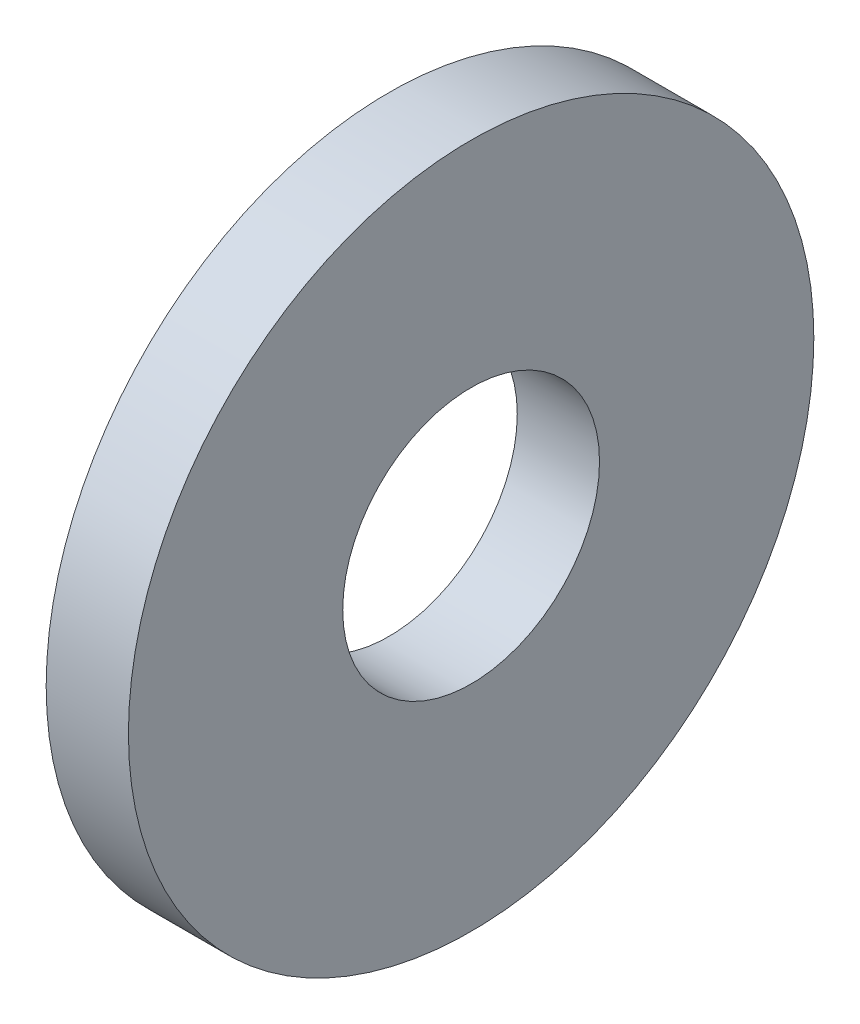
ISO-10303-21;
HEADER;
FILE_DESCRIPTION(('STEP AP214'),'2;1');
FILE_NAME('part.step','',(''),(''),'','','');
FILE_SCHEMA(('AUTOMOTIVE_DESIGN { 1 0 10303 214 1 1 1 1 }'));
ENDSEC;
DATA;
#1=APPLICATION_CONTEXT('core data for automotive mechanical design processes');
#2=APPLICATION_PROTOCOL_DEFINITION('international standard','automotive_design',2000,#1);
#3=PRODUCT_CONTEXT('',#1,'mechanical');
#4=PRODUCT('Part','Part','',(#3));
#5=PRODUCT_RELATED_PRODUCT_CATEGORY('part','',(#4));
#6=PRODUCT_DEFINITION_FORMATION('','',#4);
#7=PRODUCT_DEFINITION_CONTEXT('part definition',#1,'design');
#8=PRODUCT_DEFINITION('design','',#6,#7);
#9=PRODUCT_DEFINITION_SHAPE('','',#8);
#10=(LENGTH_UNIT() NAMED_UNIT(*) SI_UNIT(.MILLI.,.METRE.));
#11=(NAMED_UNIT(*) PLANE_ANGLE_UNIT() SI_UNIT($,.RADIAN.));
#12=(NAMED_UNIT(*) SI_UNIT($,.STERADIAN.) SOLID_ANGLE_UNIT());
#13=UNCERTAINTY_MEASURE_WITH_UNIT(LENGTH_MEASURE(1.E-05),#10,'distance_accuracy_value','');
#14=(GEOMETRIC_REPRESENTATION_CONTEXT(3) GLOBAL_UNCERTAINTY_ASSIGNED_CONTEXT((#13)) GLOBAL_UNIT_ASSIGNED_CONTEXT((#10,
#11,#12)) REPRESENTATION_CONTEXT('',''));
#15=CARTESIAN_POINT('',(0.,0.,0.));
#16=DIRECTION('',(0.,0.,1.));
#17=DIRECTION('',(1.,0.,0.));
#18=AXIS2_PLACEMENT_3D('',#15,#16,#17);
#19=CARTESIAN_POINT('',(2.286,0.,0.));
#20=DIRECTION('',(1.,0.,0.));
#21=DIRECTION('',(0.,0.,-1.));
#22=AXIS2_PLACEMENT_3D('',#19,#20,#21);
#23=PLANE('',#22);
#24=CARTESIAN_POINT('',(2.286,0.,0.));
#25=DIRECTION('',(1.,0.,0.));
#26=DIRECTION('',(0.,0.,-1.));
#27=AXIS2_PLACEMENT_3D('',#24,#25,#26);
#28=CIRCLE('',#27,9.525);
#29=CARTESIAN_POINT('',(2.286,0.,-9.525));
#30=VERTEX_POINT('',#29);
#31=EDGE_CURVE('E10',#30,#30,#28,.T.);
#32=ORIENTED_EDGE('',*,*,#31,.T.);
#33=EDGE_LOOP('',(#32));
#34=FACE_BOUND('',#33,.T.);
#35=CARTESIAN_POINT('',(2.286,0.,0.));
#36=DIRECTION('',(1.,0.,0.));
#37=DIRECTION('',(0.,0.,-1.));
#38=AXIS2_PLACEMENT_3D('',#35,#36,#37);
#39=CIRCLE('',#38,3.5687);
#40=CARTESIAN_POINT('',(2.286,0.,-3.5687));
#41=VERTEX_POINT('',#40);
#42=EDGE_CURVE('E48',#41,#41,#39,.T.);
#43=ORIENTED_EDGE('',*,*,#42,.F.);
#44=EDGE_LOOP('',(#43));
#45=FACE_BOUND('',#44,.T.);
#46=ADVANCED_FACE('F34',(#34,#45),#23,.T.);
#47=CARTESIAN_POINT('',(0.,0.,0.));
#48=DIRECTION('',(1.,0.,0.));
#49=DIRECTION('',(0.,0.,-1.));
#50=AXIS2_PLACEMENT_3D('',#47,#48,#49);
#51=PLANE('',#50);
#52=CARTESIAN_POINT('',(0.,0.,0.));
#53=DIRECTION('',(1.,0.,0.));
#54=DIRECTION('',(0.,0.,-1.));
#55=AXIS2_PLACEMENT_3D('',#52,#53,#54);
#56=CIRCLE('',#55,9.525);
#57=CARTESIAN_POINT('',(0.,0.,-9.525));
#58=VERTEX_POINT('',#57);
#59=EDGE_CURVE('E38',#58,#58,#56,.T.);
#60=ORIENTED_EDGE('',*,*,#59,.F.);
#61=EDGE_LOOP('',(#60));
#62=FACE_BOUND('',#61,.T.);
#63=CARTESIAN_POINT('',(0.,0.,0.));
#64=DIRECTION('',(1.,0.,0.));
#65=DIRECTION('',(0.,0.,-1.));
#66=AXIS2_PLACEMENT_3D('',#63,#64,#65);
#67=CIRCLE('',#66,3.5687);
#68=CARTESIAN_POINT('',(0.,0.,-3.5687));
#69=VERTEX_POINT('',#68);
#70=EDGE_CURVE('E50',#69,#69,#67,.T.);
#71=ORIENTED_EDGE('',*,*,#70,.T.);
#72=EDGE_LOOP('',(#71));
#73=FACE_BOUND('',#72,.T.);
#74=ADVANCED_FACE('F61',(#62,#73),#51,.F.);
#75=CARTESIAN_POINT('',(2.286,0.,0.));
#76=DIRECTION('',(-1.,0.,0.));
#77=DIRECTION('',(0.,0.,1.));
#78=AXIS2_PLACEMENT_3D('',#75,#76,#77);
#79=CYLINDRICAL_SURFACE('',#78,9.525);
#80=ORIENTED_EDGE('',*,*,#31,.F.);
#81=EDGE_LOOP('',(#80));
#82=FACE_BOUND('',#81,.T.);
#83=ORIENTED_EDGE('',*,*,#59,.T.);
#84=EDGE_LOOP('',(#83));
#85=FACE_BOUND('',#84,.T.);
#86=ADVANCED_FACE('F36',(#82,#85),#79,.T.);
#87=CARTESIAN_POINT('',(2.286,0.,0.));
#88=DIRECTION('',(-1.,0.,0.));
#89=DIRECTION('',(0.,0.,1.));
#90=AXIS2_PLACEMENT_3D('',#87,#88,#89);
#91=CYLINDRICAL_SURFACE('',#90,3.5687);
#92=ORIENTED_EDGE('',*,*,#42,.T.);
#93=EDGE_LOOP('',(#92));
#94=FACE_BOUND('',#93,.T.);
#95=ORIENTED_EDGE('',*,*,#70,.F.);
#96=EDGE_LOOP('',(#95));
#97=FACE_BOUND('',#96,.T.);
#98=ADVANCED_FACE('F57',(#94,#97),#91,.F.);
#99=CLOSED_SHELL('',(#46,#74,#86,#98));
#100=MANIFOLD_SOLID_BREP('B2',#99);
#101=ADVANCED_BREP_SHAPE_REPRESENTATION('',(#18,#100),#14);
#102=SHAPE_DEFINITION_REPRESENTATION(#9,#101);
ENDSEC;
END-ISO-10303-21;
